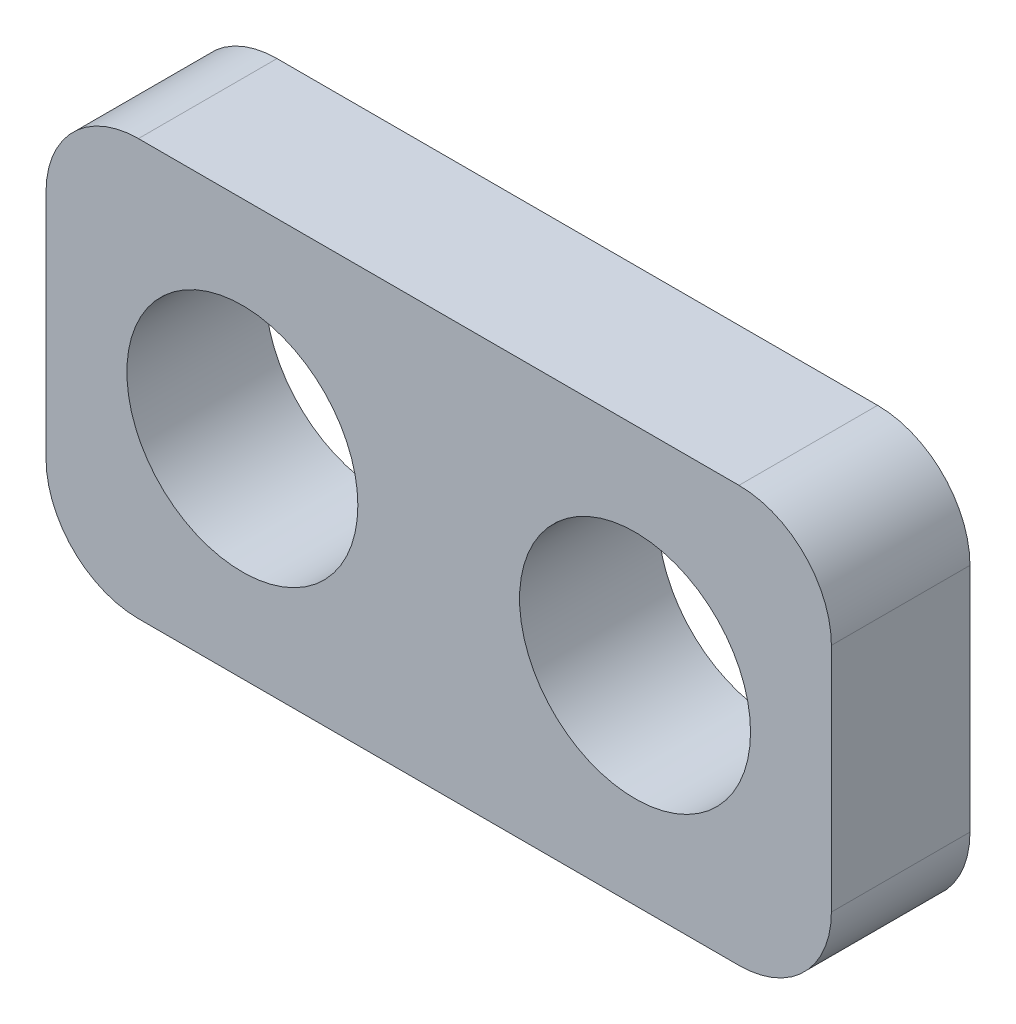
ISO-10303-21;
HEADER;
FILE_DESCRIPTION(('STEP AP214'),'2;1');
FILE_NAME('part.step','',(''),(''),'','','');
FILE_SCHEMA(('AUTOMOTIVE_DESIGN { 1 0 10303 214 1 1 1 1 }'));
ENDSEC;
DATA;
#1=APPLICATION_CONTEXT('core data for automotive mechanical design processes');
#2=APPLICATION_PROTOCOL_DEFINITION('international standard','automotive_design',2000,#1);
#3=PRODUCT_CONTEXT('',#1,'mechanical');
#4=PRODUCT('Part','Part','',(#3));
#5=PRODUCT_RELATED_PRODUCT_CATEGORY('part','',(#4));
#6=PRODUCT_DEFINITION_FORMATION('','',#4);
#7=PRODUCT_DEFINITION_CONTEXT('part definition',#1,'design');
#8=PRODUCT_DEFINITION('design','',#6,#7);
#9=PRODUCT_DEFINITION_SHAPE('','',#8);
#10=(LENGTH_UNIT() NAMED_UNIT(*) SI_UNIT(.MILLI.,.METRE.));
#11=(NAMED_UNIT(*) PLANE_ANGLE_UNIT() SI_UNIT($,.RADIAN.));
#12=(NAMED_UNIT(*) SI_UNIT($,.STERADIAN.) SOLID_ANGLE_UNIT());
#13=UNCERTAINTY_MEASURE_WITH_UNIT(LENGTH_MEASURE(1.E-05),#10,'distance_accuracy_value','');
#14=(GEOMETRIC_REPRESENTATION_CONTEXT(3) GLOBAL_UNCERTAINTY_ASSIGNED_CONTEXT((#13)) GLOBAL_UNIT_ASSIGNED_CONTEXT((#10,
#11,#12)) REPRESENTATION_CONTEXT('',''));
#15=CARTESIAN_POINT('',(0.,0.,0.));
#16=DIRECTION('',(0.,0.,1.));
#17=DIRECTION('',(1.,0.,0.));
#18=AXIS2_PLACEMENT_3D('',#15,#16,#17);
#19=CARTESIAN_POINT('',(6.5,2.5,3.));
#20=DIRECTION('',(0.,0.,-1.));
#21=DIRECTION('',(-1.,0.,0.));
#22=AXIS2_PLACEMENT_3D('',#19,#20,#21);
#23=PLANE('',#22);
#24=CARTESIAN_POINT('',(6.5,2.5,3.));
#25=DIRECTION('',(0.,0.,1.));
#26=DIRECTION('',(-1.,0.,0.));
#27=AXIS2_PLACEMENT_3D('',#24,#25,#26);
#28=CIRCLE('',#27,2.);
#29=CARTESIAN_POINT('',(8.5,2.49999999999999,3.));
#30=VERTEX_POINT('',#29);
#31=CARTESIAN_POINT('',(6.49999999999999,4.5,3.));
#32=VERTEX_POINT('',#31);
#33=EDGE_CURVE('E164',#30,#32,#28,.T.);
#34=ORIENTED_EDGE('',*,*,#33,.T.);
#35=DIRECTION('',(-1.,0.,0.));
#36=VECTOR('',#35,1.);
#37=CARTESIAN_POINT('',(-6.49999999999999,4.5,3.));
#38=LINE('',#37,#36);
#39=CARTESIAN_POINT('',(-6.49999999999999,4.5,3.));
#40=VERTEX_POINT('',#39);
#41=EDGE_CURVE('E100',#32,#40,#38,.T.);
#42=ORIENTED_EDGE('',*,*,#41,.T.);
#43=CARTESIAN_POINT('',(-6.5,2.5,3.));
#44=DIRECTION('',(0.,0.,1.));
#45=DIRECTION('',(-1.,0.,0.));
#46=AXIS2_PLACEMENT_3D('',#43,#44,#45);
#47=CIRCLE('',#46,2.);
#48=CARTESIAN_POINT('',(-8.5,2.49999999999999,3.));
#49=VERTEX_POINT('',#48);
#50=EDGE_CURVE('E185',#40,#49,#47,.T.);
#51=ORIENTED_EDGE('',*,*,#50,.T.);
#52=DIRECTION('',(0.,-1.,0.));
#53=VECTOR('',#52,1.);
#54=CARTESIAN_POINT('',(-8.5,-2.49999999999999,3.));
#55=LINE('',#54,#53);
#56=CARTESIAN_POINT('',(-8.5,-2.49999999999999,3.));
#57=VERTEX_POINT('',#56);
#58=EDGE_CURVE('E199',#49,#57,#55,.T.);
#59=ORIENTED_EDGE('',*,*,#58,.T.);
#60=CARTESIAN_POINT('',(-6.5,-2.5,3.));
#61=DIRECTION('',(0.,0.,1.));
#62=DIRECTION('',(-1.,0.,0.));
#63=AXIS2_PLACEMENT_3D('',#60,#61,#62);
#64=CIRCLE('',#63,2.);
#65=CARTESIAN_POINT('',(-6.49999999999999,-4.5,3.));
#66=VERTEX_POINT('',#65);
#67=EDGE_CURVE('E119',#57,#66,#64,.T.);
#68=ORIENTED_EDGE('',*,*,#67,.T.);
#69=DIRECTION('',(1.,0.,0.));
#70=VECTOR('',#69,1.);
#71=CARTESIAN_POINT('',(-6.49999999999999,-4.5,3.));
#72=LINE('',#71,#70);
#73=CARTESIAN_POINT('',(6.49999999999999,-4.5,3.));
#74=VERTEX_POINT('',#73);
#75=EDGE_CURVE('E113',#66,#74,#72,.T.);
#76=ORIENTED_EDGE('',*,*,#75,.T.);
#77=CARTESIAN_POINT('',(6.5,-2.5,3.));
#78=DIRECTION('',(0.,0.,1.));
#79=DIRECTION('',(1.,0.,0.));
#80=AXIS2_PLACEMENT_3D('',#77,#78,#79);
#81=CIRCLE('',#80,2.);
#82=CARTESIAN_POINT('',(8.5,-2.5,3.));
#83=VERTEX_POINT('',#82);
#84=EDGE_CURVE('E117',#74,#83,#81,.T.);
#85=ORIENTED_EDGE('',*,*,#84,.T.);
#86=DIRECTION('',(0.,1.,0.));
#87=VECTOR('',#86,1.);
#88=CARTESIAN_POINT('',(8.5,-2.49999999999999,3.));
#89=LINE('',#88,#87);
#90=EDGE_CURVE('E57',#83,#30,#89,.T.);
#91=ORIENTED_EDGE('',*,*,#90,.T.);
#92=EDGE_LOOP('',(#34,#42,#51,#59,#68,#76,#85,#91));
#93=FACE_BOUND('',#92,.T.);
#94=CARTESIAN_POINT('',(-4.25,0.,3.));
#95=DIRECTION('',(0.,0.,1.));
#96=DIRECTION('',(1.,0.,0.));
#97=AXIS2_PLACEMENT_3D('',#94,#95,#96);
#98=CIRCLE('',#97,2.5);
#99=CARTESIAN_POINT('',(-1.75,0.,3.));
#100=VERTEX_POINT('',#99);
#101=EDGE_CURVE('E146',#100,#100,#98,.T.);
#102=ORIENTED_EDGE('',*,*,#101,.F.);
#103=EDGE_LOOP('',(#102));
#104=FACE_BOUND('',#103,.T.);
#105=CARTESIAN_POINT('',(4.25,0.,3.));
#106=DIRECTION('',(0.,0.,1.));
#107=DIRECTION('',(1.,0.,0.));
#108=AXIS2_PLACEMENT_3D('',#105,#106,#107);
#109=CIRCLE('',#108,2.5);
#110=CARTESIAN_POINT('',(6.75,0.,3.));
#111=VERTEX_POINT('',#110);
#112=EDGE_CURVE('E213',#111,#111,#109,.T.);
#113=ORIENTED_EDGE('',*,*,#112,.F.);
#114=EDGE_LOOP('',(#113));
#115=FACE_BOUND('',#114,.T.);
#116=ADVANCED_FACE('F39',(#93,#104,#115),#23,.F.);
#117=CARTESIAN_POINT('',(6.5,2.5,0.));
#118=DIRECTION('',(0.,0.,-1.));
#119=DIRECTION('',(-1.,0.,0.));
#120=AXIS2_PLACEMENT_3D('',#117,#118,#119);
#121=PLANE('',#120);
#122=CARTESIAN_POINT('',(-4.25,0.,0.));
#123=DIRECTION('',(0.,0.,1.));
#124=DIRECTION('',(1.,0.,0.));
#125=AXIS2_PLACEMENT_3D('',#122,#123,#124);
#126=CIRCLE('',#125,2.5);
#127=CARTESIAN_POINT('',(-1.75,0.,0.));
#128=VERTEX_POINT('',#127);
#129=EDGE_CURVE('E209',#128,#128,#126,.T.);
#130=ORIENTED_EDGE('',*,*,#129,.T.);
#131=EDGE_LOOP('',(#130));
#132=FACE_BOUND('',#131,.T.);
#133=CARTESIAN_POINT('',(6.5,2.5,0.));
#134=DIRECTION('',(0.,0.,1.));
#135=DIRECTION('',(-1.,0.,0.));
#136=AXIS2_PLACEMENT_3D('',#133,#134,#135);
#137=CIRCLE('',#136,2.);
#138=CARTESIAN_POINT('',(8.5,2.49999999999999,0.));
#139=VERTEX_POINT('',#138);
#140=CARTESIAN_POINT('',(6.49999999999999,4.5,0.));
#141=VERTEX_POINT('',#140);
#142=EDGE_CURVE('E141',#139,#141,#137,.T.);
#143=ORIENTED_EDGE('',*,*,#142,.F.);
#144=DIRECTION('',(0.,1.,0.));
#145=VECTOR('',#144,1.);
#146=CARTESIAN_POINT('',(8.5,-2.49999999999999,0.));
#147=LINE('',#146,#145);
#148=CARTESIAN_POINT('',(8.5,-2.5,0.));
#149=VERTEX_POINT('',#148);
#150=EDGE_CURVE('E92',#149,#139,#147,.T.);
#151=ORIENTED_EDGE('',*,*,#150,.F.);
#152=CARTESIAN_POINT('',(6.5,-2.5,0.));
#153=DIRECTION('',(0.,0.,1.));
#154=DIRECTION('',(1.,0.,0.));
#155=AXIS2_PLACEMENT_3D('',#152,#153,#154);
#156=CIRCLE('',#155,2.);
#157=CARTESIAN_POINT('',(6.49999999999999,-4.5,0.));
#158=VERTEX_POINT('',#157);
#159=EDGE_CURVE('E86',#158,#149,#156,.T.);
#160=ORIENTED_EDGE('',*,*,#159,.F.);
#161=DIRECTION('',(1.,0.,0.));
#162=VECTOR('',#161,1.);
#163=CARTESIAN_POINT('',(-6.49999999999999,-4.5,0.));
#164=LINE('',#163,#162);
#165=CARTESIAN_POINT('',(-6.49999999999999,-4.5,0.));
#166=VERTEX_POINT('',#165);
#167=EDGE_CURVE('E128',#166,#158,#164,.T.);
#168=ORIENTED_EDGE('',*,*,#167,.F.);
#169=CARTESIAN_POINT('',(-6.5,-2.5,0.));
#170=DIRECTION('',(0.,0.,1.));
#171=DIRECTION('',(-1.,0.,0.));
#172=AXIS2_PLACEMENT_3D('',#169,#170,#171);
#173=CIRCLE('',#172,2.);
#174=CARTESIAN_POINT('',(-8.5,-2.49999999999999,0.));
#175=VERTEX_POINT('',#174);
#176=EDGE_CURVE('E155',#175,#166,#173,.T.);
#177=ORIENTED_EDGE('',*,*,#176,.F.);
#178=DIRECTION('',(0.,-1.,0.));
#179=VECTOR('',#178,1.);
#180=CARTESIAN_POINT('',(-8.5,-2.49999999999999,0.));
#181=LINE('',#180,#179);
#182=CARTESIAN_POINT('',(-8.5,2.49999999999999,0.));
#183=VERTEX_POINT('',#182);
#184=EDGE_CURVE('E152',#183,#175,#181,.T.);
#185=ORIENTED_EDGE('',*,*,#184,.F.);
#186=CARTESIAN_POINT('',(-6.5,2.5,0.));
#187=DIRECTION('',(0.,0.,1.));
#188=DIRECTION('',(-1.,0.,0.));
#189=AXIS2_PLACEMENT_3D('',#186,#187,#188);
#190=CIRCLE('',#189,2.);
#191=CARTESIAN_POINT('',(-6.49999999999999,4.5,0.));
#192=VERTEX_POINT('',#191);
#193=EDGE_CURVE('E149',#192,#183,#190,.T.);
#194=ORIENTED_EDGE('',*,*,#193,.F.);
#195=DIRECTION('',(-1.,0.,0.));
#196=VECTOR('',#195,1.);
#197=CARTESIAN_POINT('',(-6.49999999999999,4.5,0.));
#198=LINE('',#197,#196);
#199=EDGE_CURVE('E145',#141,#192,#198,.T.);
#200=ORIENTED_EDGE('',*,*,#199,.F.);
#201=EDGE_LOOP('',(#143,#151,#160,#168,#177,#185,#194,#200));
#202=FACE_BOUND('',#201,.T.);
#203=CARTESIAN_POINT('',(4.25,0.,0.));
#204=DIRECTION('',(0.,0.,1.));
#205=DIRECTION('',(1.,0.,0.));
#206=AXIS2_PLACEMENT_3D('',#203,#204,#205);
#207=CIRCLE('',#206,2.5);
#208=CARTESIAN_POINT('',(6.75,0.,0.));
#209=VERTEX_POINT('',#208);
#210=EDGE_CURVE('E217',#209,#209,#207,.T.);
#211=ORIENTED_EDGE('',*,*,#210,.T.);
#212=EDGE_LOOP('',(#211));
#213=FACE_BOUND('',#212,.T.);
#214=ADVANCED_FACE('F189',(#132,#202,#213),#121,.T.);
#215=CARTESIAN_POINT('',(6.5,2.5,3.));
#216=DIRECTION('',(0.,0.,-1.));
#217=DIRECTION('',(-1.,0.,0.));
#218=AXIS2_PLACEMENT_3D('',#215,#216,#217);
#219=CYLINDRICAL_SURFACE('',#218,2.);
#220=ORIENTED_EDGE('',*,*,#142,.T.);
#221=DIRECTION('',(0.,0.,-1.));
#222=VECTOR('',#221,1.);
#223=CARTESIAN_POINT('',(6.49999999999999,4.5,3.));
#224=LINE('',#223,#222);
#225=EDGE_CURVE('E11',#32,#141,#224,.T.);
#226=ORIENTED_EDGE('',*,*,#225,.F.);
#227=ORIENTED_EDGE('',*,*,#33,.F.);
#228=DIRECTION('',(0.,0.,-1.));
#229=VECTOR('',#228,1.);
#230=CARTESIAN_POINT('',(8.5,2.49999999999999,3.));
#231=LINE('',#230,#229);
#232=EDGE_CURVE('E137',#30,#139,#231,.T.);
#233=ORIENTED_EDGE('',*,*,#232,.T.);
#234=EDGE_LOOP('',(#220,#226,#227,#233));
#235=FACE_BOUND('',#234,.T.);
#236=ADVANCED_FACE('F41',(#235),#219,.T.);
#237=CARTESIAN_POINT('',(-6.49999999999999,4.5,3.));
#238=DIRECTION('',(0.,-1.,0.));
#239=DIRECTION('',(0.,0.,-1.));
#240=AXIS2_PLACEMENT_3D('',#237,#238,#239);
#241=PLANE('',#240);
#242=ORIENTED_EDGE('',*,*,#199,.T.);
#243=DIRECTION('',(0.,0.,-1.));
#244=VECTOR('',#243,1.);
#245=CARTESIAN_POINT('',(-6.49999999999999,4.5,3.));
#246=LINE('',#245,#244);
#247=EDGE_CURVE('E49',#40,#192,#246,.T.);
#248=ORIENTED_EDGE('',*,*,#247,.F.);
#249=ORIENTED_EDGE('',*,*,#41,.F.);
#250=ORIENTED_EDGE('',*,*,#225,.T.);
#251=EDGE_LOOP('',(#242,#248,#249,#250));
#252=FACE_BOUND('',#251,.T.);
#253=ADVANCED_FACE('F251',(#252),#241,.F.);
#254=CARTESIAN_POINT('',(-6.5,2.5,3.));
#255=DIRECTION('',(0.,0.,-1.));
#256=DIRECTION('',(-1.,0.,0.));
#257=AXIS2_PLACEMENT_3D('',#254,#255,#256);
#258=CYLINDRICAL_SURFACE('',#257,2.);
#259=ORIENTED_EDGE('',*,*,#193,.T.);
#260=DIRECTION('',(0.,0.,-1.));
#261=VECTOR('',#260,1.);
#262=CARTESIAN_POINT('',(-8.5,2.49999999999999,3.));
#263=LINE('',#262,#261);
#264=EDGE_CURVE('E175',#49,#183,#263,.T.);
#265=ORIENTED_EDGE('',*,*,#264,.F.);
#266=ORIENTED_EDGE('',*,*,#50,.F.);
#267=ORIENTED_EDGE('',*,*,#247,.T.);
#268=EDGE_LOOP('',(#259,#265,#266,#267));
#269=FACE_BOUND('',#268,.T.);
#270=ADVANCED_FACE('F183',(#269),#258,.T.);
#271=CARTESIAN_POINT('',(-8.5,-2.49999999999999,3.));
#272=DIRECTION('',(1.,0.,0.));
#273=DIRECTION('',(0.,0.,-1.));
#274=AXIS2_PLACEMENT_3D('',#271,#272,#273);
#275=PLANE('',#274);
#276=ORIENTED_EDGE('',*,*,#184,.T.);
#277=DIRECTION('',(0.,0.,-1.));
#278=VECTOR('',#277,1.);
#279=CARTESIAN_POINT('',(-8.5,-2.49999999999999,3.));
#280=LINE('',#279,#278);
#281=EDGE_CURVE('E171',#57,#175,#280,.T.);
#282=ORIENTED_EDGE('',*,*,#281,.F.);
#283=ORIENTED_EDGE('',*,*,#58,.F.);
#284=ORIENTED_EDGE('',*,*,#264,.T.);
#285=EDGE_LOOP('',(#276,#282,#283,#284));
#286=FACE_BOUND('',#285,.T.);
#287=ADVANCED_FACE('F194',(#286),#275,.F.);
#288=CARTESIAN_POINT('',(-6.5,-2.5,3.));
#289=DIRECTION('',(0.,0.,-1.));
#290=DIRECTION('',(-1.,0.,0.));
#291=AXIS2_PLACEMENT_3D('',#288,#289,#290);
#292=CYLINDRICAL_SURFACE('',#291,2.);
#293=ORIENTED_EDGE('',*,*,#176,.T.);
#294=DIRECTION('',(0.,0.,-1.));
#295=VECTOR('',#294,1.);
#296=CARTESIAN_POINT('',(-6.49999999999999,-4.5,3.));
#297=LINE('',#296,#295);
#298=EDGE_CURVE('E130',#66,#166,#297,.T.);
#299=ORIENTED_EDGE('',*,*,#298,.F.);
#300=ORIENTED_EDGE('',*,*,#67,.F.);
#301=ORIENTED_EDGE('',*,*,#281,.T.);
#302=EDGE_LOOP('',(#293,#299,#300,#301));
#303=FACE_BOUND('',#302,.T.);
#304=ADVANCED_FACE('F197',(#303),#292,.T.);
#305=CARTESIAN_POINT('',(-6.49999999999999,-4.5,3.));
#306=DIRECTION('',(0.,1.,0.));
#307=DIRECTION('',(0.,0.,1.));
#308=AXIS2_PLACEMENT_3D('',#305,#306,#307);
#309=PLANE('',#308);
#310=ORIENTED_EDGE('',*,*,#167,.T.);
#311=DIRECTION('',(0.,0.,-1.));
#312=VECTOR('',#311,1.);
#313=CARTESIAN_POINT('',(6.49999999999999,-4.5,3.));
#314=LINE('',#313,#312);
#315=EDGE_CURVE('E125',#74,#158,#314,.T.);
#316=ORIENTED_EDGE('',*,*,#315,.F.);
#317=ORIENTED_EDGE('',*,*,#75,.F.);
#318=ORIENTED_EDGE('',*,*,#298,.T.);
#319=EDGE_LOOP('',(#310,#316,#317,#318));
#320=FACE_BOUND('',#319,.T.);
#321=ADVANCED_FACE('F126',(#320),#309,.F.);
#322=CARTESIAN_POINT('',(6.5,-2.5,3.));
#323=DIRECTION('',(0.,0.,-1.));
#324=DIRECTION('',(-1.,0.,0.));
#325=AXIS2_PLACEMENT_3D('',#322,#323,#324);
#326=CYLINDRICAL_SURFACE('',#325,2.);
#327=ORIENTED_EDGE('',*,*,#159,.T.);
#328=DIRECTION('',(0.,0.,-1.));
#329=VECTOR('',#328,1.);
#330=CARTESIAN_POINT('',(8.5,-2.5,3.));
#331=LINE('',#330,#329);
#332=EDGE_CURVE('E131',#83,#149,#331,.T.);
#333=ORIENTED_EDGE('',*,*,#332,.F.);
#334=ORIENTED_EDGE('',*,*,#84,.F.);
#335=ORIENTED_EDGE('',*,*,#315,.T.);
#336=EDGE_LOOP('',(#327,#333,#334,#335));
#337=FACE_BOUND('',#336,.T.);
#338=ADVANCED_FACE('F133',(#337),#326,.T.);
#339=CARTESIAN_POINT('',(8.5,-2.49999999999999,3.));
#340=DIRECTION('',(-1.,0.,0.));
#341=DIRECTION('',(0.,0.,1.));
#342=AXIS2_PLACEMENT_3D('',#339,#340,#341);
#343=PLANE('',#342);
#344=ORIENTED_EDGE('',*,*,#150,.T.);
#345=ORIENTED_EDGE('',*,*,#232,.F.);
#346=ORIENTED_EDGE('',*,*,#90,.F.);
#347=ORIENTED_EDGE('',*,*,#332,.T.);
#348=EDGE_LOOP('',(#344,#345,#346,#347));
#349=FACE_BOUND('',#348,.T.);
#350=ADVANCED_FACE('F239',(#349),#343,.F.);
#351=CARTESIAN_POINT('',(-4.25,0.,3.));
#352=DIRECTION('',(0.,0.,-1.));
#353=DIRECTION('',(-1.,0.,0.));
#354=AXIS2_PLACEMENT_3D('',#351,#352,#353);
#355=CYLINDRICAL_SURFACE('',#354,2.5);
#356=ORIENTED_EDGE('',*,*,#101,.T.);
#357=EDGE_LOOP('',(#356));
#358=FACE_BOUND('',#357,.T.);
#359=ORIENTED_EDGE('',*,*,#129,.F.);
#360=EDGE_LOOP('',(#359));
#361=FACE_BOUND('',#360,.T.);
#362=ADVANCED_FACE('F236',(#358,#361),#355,.F.);
#363=CARTESIAN_POINT('',(4.25,0.,3.));
#364=DIRECTION('',(0.,0.,-1.));
#365=DIRECTION('',(-1.,0.,0.));
#366=AXIS2_PLACEMENT_3D('',#363,#364,#365);
#367=CYLINDRICAL_SURFACE('',#366,2.5);
#368=ORIENTED_EDGE('',*,*,#112,.T.);
#369=EDGE_LOOP('',(#368));
#370=FACE_BOUND('',#369,.T.);
#371=ORIENTED_EDGE('',*,*,#210,.F.);
#372=EDGE_LOOP('',(#371));
#373=FACE_BOUND('',#372,.T.);
#374=ADVANCED_FACE('F225',(#370,#373),#367,.F.);
#375=CLOSED_SHELL('',(#116,#214,#236,#253,#270,#287,#304,#321,#338,#350,#362,#374));
#376=MANIFOLD_SOLID_BREP('B2',#375);
#377=ADVANCED_BREP_SHAPE_REPRESENTATION('',(#18,#376),#14);
#378=SHAPE_DEFINITION_REPRESENTATION(#9,#377);
ENDSEC;
END-ISO-10303-21;
